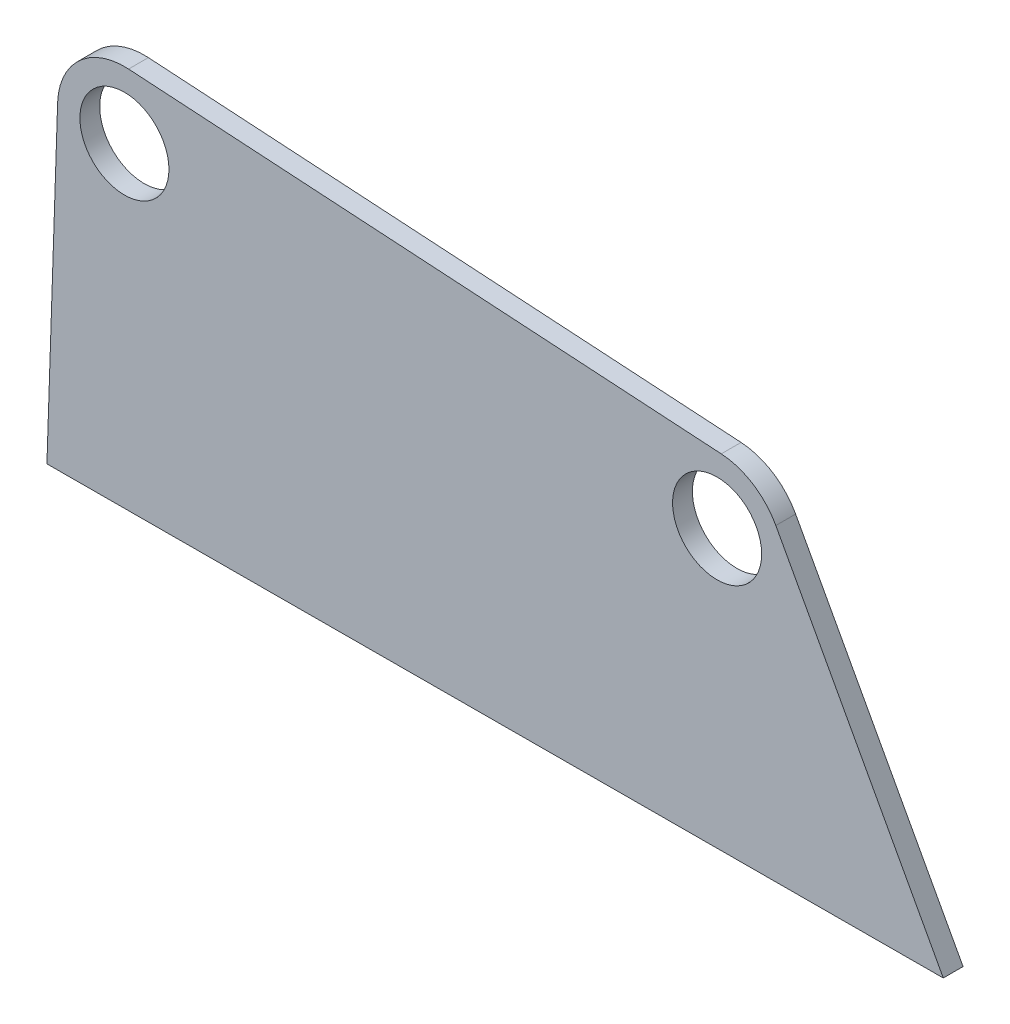
ISO-10303-21;
HEADER;
FILE_DESCRIPTION(('STEP AP214'),'2;1');
FILE_NAME('part.step','',(''),(''),'','','');
FILE_SCHEMA(('AUTOMOTIVE_DESIGN { 1 0 10303 214 1 1 1 1 }'));
ENDSEC;
DATA;
#1=APPLICATION_CONTEXT('core data for automotive mechanical design processes');
#2=APPLICATION_PROTOCOL_DEFINITION('international standard','automotive_design',2000,#1);
#3=PRODUCT_CONTEXT('',#1,'mechanical');
#4=PRODUCT('Part','Part','',(#3));
#5=PRODUCT_RELATED_PRODUCT_CATEGORY('part','',(#4));
#6=PRODUCT_DEFINITION_FORMATION('','',#4);
#7=PRODUCT_DEFINITION_CONTEXT('part definition',#1,'design');
#8=PRODUCT_DEFINITION('design','',#6,#7);
#9=PRODUCT_DEFINITION_SHAPE('','',#8);
#10=(LENGTH_UNIT() NAMED_UNIT(*) SI_UNIT(.MILLI.,.METRE.));
#11=(NAMED_UNIT(*) PLANE_ANGLE_UNIT() SI_UNIT($,.RADIAN.));
#12=(NAMED_UNIT(*) SI_UNIT($,.STERADIAN.) SOLID_ANGLE_UNIT());
#13=UNCERTAINTY_MEASURE_WITH_UNIT(LENGTH_MEASURE(1.E-05),#10,'distance_accuracy_value','');
#14=(GEOMETRIC_REPRESENTATION_CONTEXT(3) GLOBAL_UNCERTAINTY_ASSIGNED_CONTEXT((#13)) GLOBAL_UNIT_ASSIGNED_CONTEXT((#10,
#11,#12)) REPRESENTATION_CONTEXT('',''));
#15=CARTESIAN_POINT('',(0.,0.,0.));
#16=DIRECTION('',(0.,0.,1.));
#17=DIRECTION('',(1.,0.,0.));
#18=AXIS2_PLACEMENT_3D('',#15,#16,#17);
#19=CARTESIAN_POINT('',(13.925563591016,223.617790180787,3.175));
#20=DIRECTION('',(0.0621535517410026,0.998066598983243,0.));
#21=DIRECTION('',(-0.998066598983243,0.0621535517410026,0.));
#22=AXIS2_PLACEMENT_3D('',#19,#20,#21);
#23=PLANE('',#22);
#24=DIRECTION('',(0.998066598983243,-0.0621535517410026,0.));
#25=VECTOR('',#24,1.);
#26=CARTESIAN_POINT('',(13.925563591016,223.617790180787,-3.175));
#27=LINE('',#26,#25);
#28=CARTESIAN_POINT('',(143.15199643339,215.570349470762,-3.175));
#29=VERTEX_POINT('',#28);
#30=CARTESIAN_POINT('',(333.283683539698,203.730097864101,-3.175));
#31=VERTEX_POINT('',#30);
#32=EDGE_CURVE('E129',#29,#31,#27,.T.);
#33=ORIENTED_EDGE('',*,*,#32,.F.);
#34=DIRECTION('',(0.,0.,-1.));
#35=VECTOR('',#34,1.);
#36=CARTESIAN_POINT('',(143.15199643339,215.570349470762,3.175));
#37=LINE('',#36,#35);
#38=CARTESIAN_POINT('',(143.15199643339,215.570349470762,3.175));
#39=VERTEX_POINT('',#38);
#40=EDGE_CURVE('E11',#39,#29,#37,.T.);
#41=ORIENTED_EDGE('',*,*,#40,.F.);
#42=DIRECTION('',(0.998066598983243,-0.0621535517410026,0.));
#43=VECTOR('',#42,1.);
#44=CARTESIAN_POINT('',(13.925563591016,223.617790180787,3.175));
#45=LINE('',#44,#43);
#46=CARTESIAN_POINT('',(333.283683539698,203.730097864101,3.175));
#47=VERTEX_POINT('',#46);
#48=EDGE_CURVE('E146',#39,#47,#45,.T.);
#49=ORIENTED_EDGE('',*,*,#48,.T.);
#50=DIRECTION('',(0.,0.,-1.));
#51=VECTOR('',#50,1.);
#52=CARTESIAN_POINT('',(333.283683539698,203.730097864101,3.175));
#53=LINE('',#52,#51);
#54=EDGE_CURVE('E86',#47,#31,#53,.T.);
#55=ORIENTED_EDGE('',*,*,#54,.T.);
#56=EDGE_LOOP('',(#33,#41,#49,#55));
#57=FACE_BOUND('',#56,.T.);
#58=ADVANCED_FACE('F41',(#57),#23,.T.);
#59=CARTESIAN_POINT('',(141.81996812764,194.180534671303,3.175));
#60=DIRECTION('',(0.,0.,-1.));
#61=DIRECTION('',(-1.,0.,0.));
#62=AXIS2_PLACEMENT_3D('',#59,#60,#61);
#63=CYLINDRICAL_SURFACE('',#62,21.4312500000001);
#64=CARTESIAN_POINT('',(141.81996812764,194.180534671303,-3.175));
#65=DIRECTION('',(0.,0.,1.));
#66=DIRECTION('',(1.,0.,0.));
#67=AXIS2_PLACEMENT_3D('',#64,#65,#66);
#68=CIRCLE('',#67,21.4312500000001);
#69=CARTESIAN_POINT('',(120.400853613145,194.901651844464,-3.175));
#70=VERTEX_POINT('',#69);
#71=EDGE_CURVE('E132',#29,#70,#68,.T.);
#72=ORIENTED_EDGE('',*,*,#71,.T.);
#73=DIRECTION('',(0.,0.,-1.));
#74=VECTOR('',#73,1.);
#75=CARTESIAN_POINT('',(120.400853613145,194.901651844464,3.175));
#76=LINE('',#75,#74);
#77=CARTESIAN_POINT('',(120.400853613145,194.901651844464,3.175));
#78=VERTEX_POINT('',#77);
#79=EDGE_CURVE('E49',#78,#70,#76,.T.);
#80=ORIENTED_EDGE('',*,*,#79,.F.);
#81=CARTESIAN_POINT('',(141.81996812764,194.180534671303,3.175));
#82=DIRECTION('',(0.,0.,1.));
#83=DIRECTION('',(1.,0.,0.));
#84=AXIS2_PLACEMENT_3D('',#81,#82,#83);
#85=CIRCLE('',#84,21.4312500000001);
#86=EDGE_CURVE('E162',#39,#78,#85,.T.);
#87=ORIENTED_EDGE('',*,*,#86,.F.);
#88=ORIENTED_EDGE('',*,*,#40,.T.);
#89=EDGE_LOOP('',(#72,#80,#87,#88));
#90=FACE_BOUND('',#89,.T.);
#91=ADVANCED_FACE('F165',(#90),#63,.T.);
#92=CARTESIAN_POINT('',(113.710214405219,-3.82828096446189,3.175));
#93=DIRECTION('',(0.999433748124608,-0.0336479287564392,0.));
#94=DIRECTION('',(0.0336479287564392,0.999433748124608,0.));
#95=AXIS2_PLACEMENT_3D('',#92,#93,#94);
#96=PLANE('',#95);
#97=DIRECTION('',(-0.0336479287564392,-0.999433748124608,0.));
#98=VECTOR('',#97,1.);
#99=CARTESIAN_POINT('',(113.710214405219,-3.82828096446189,-3.175));
#100=LINE('',#99,#98);
#101=CARTESIAN_POINT('',(116.962765473806,92.7812110781298,-3.175));
#102=VERTEX_POINT('',#101);
#103=EDGE_CURVE('E134',#70,#102,#100,.T.);
#104=ORIENTED_EDGE('',*,*,#103,.T.);
#105=DIRECTION('',(0.,0.,-1.));
#106=VECTOR('',#105,1.);
#107=CARTESIAN_POINT('',(116.962765473806,92.7812110781298,3.175));
#108=LINE('',#107,#106);
#109=CARTESIAN_POINT('',(116.962765473806,92.7812110781298,3.175));
#110=VERTEX_POINT('',#109);
#111=EDGE_CURVE('E115',#110,#102,#108,.T.);
#112=ORIENTED_EDGE('',*,*,#111,.F.);
#113=DIRECTION('',(-0.0336479287564392,-0.999433748124608,0.));
#114=VECTOR('',#113,1.);
#115=CARTESIAN_POINT('',(113.710214405219,-3.82828096446189,3.175));
#116=LINE('',#115,#114);
#117=EDGE_CURVE('E106',#78,#110,#116,.T.);
#118=ORIENTED_EDGE('',*,*,#117,.F.);
#119=ORIENTED_EDGE('',*,*,#79,.T.);
#120=EDGE_LOOP('',(#104,#112,#118,#119));
#121=FACE_BOUND('',#120,.T.);
#122=ADVANCED_FACE('F153',(#121),#96,.F.);
#123=CARTESIAN_POINT('',(-0.30359503844637,92.3958965070931,3.175));
#124=DIRECTION('',(-0.00328578877472885,0.999994601781493,0.));
#125=DIRECTION('',(-0.999994601781494,-0.00328578877472885,0.));
#126=AXIS2_PLACEMENT_3D('',#123,#124,#125);
#127=PLANE('',#126);
#128=DIRECTION('',(0.999994601781494,0.00328578877472885,0.));
#129=VECTOR('',#128,1.);
#130=CARTESIAN_POINT('',(-0.30359503844637,92.3958965070931,-3.175));
#131=LINE('',#130,#129);
#132=CARTESIAN_POINT('',(404.499149114623,93.726,-3.175));
#133=VERTEX_POINT('',#132);
#134=EDGE_CURVE('E114',#102,#133,#131,.T.);
#135=ORIENTED_EDGE('',*,*,#134,.T.);
#136=DIRECTION('',(0.,0.,-1.));
#137=VECTOR('',#136,1.);
#138=CARTESIAN_POINT('',(404.499149114623,93.726,3.175));
#139=LINE('',#138,#137);
#140=CARTESIAN_POINT('',(404.499149114623,93.726,3.175));
#141=VERTEX_POINT('',#140);
#142=EDGE_CURVE('E111',#141,#133,#139,.T.);
#143=ORIENTED_EDGE('',*,*,#142,.F.);
#144=DIRECTION('',(0.999994601781494,0.00328578877472885,0.));
#145=VECTOR('',#144,1.);
#146=CARTESIAN_POINT('',(-0.30359503844637,92.3958965070931,3.175));
#147=LINE('',#146,#145);
#148=EDGE_CURVE('E99',#110,#141,#147,.T.);
#149=ORIENTED_EDGE('',*,*,#148,.F.);
#150=ORIENTED_EDGE('',*,*,#111,.T.);
#151=EDGE_LOOP('',(#135,#143,#149,#150));
#152=FACE_BOUND('',#151,.T.);
#153=ADVANCED_FACE('F112',(#152),#127,.F.);
#154=CARTESIAN_POINT('',(351.598472051144,191.070967862355,3.175));
#155=DIRECTION('',(-0.878640401948522,-0.477484077288175,0.));
#156=DIRECTION('',(0.477484077288175,-0.878640401948522,0.));
#157=AXIS2_PLACEMENT_3D('',#154,#155,#156);
#158=PLANE('',#157);
#159=DIRECTION('',(-0.477484077288175,0.878640401948522,0.));
#160=VECTOR('',#159,1.);
#161=CARTESIAN_POINT('',(351.598472051144,191.070967862355,-3.175));
#162=LINE('',#161,#160);
#163=CARTESIAN_POINT('',(350.782017348207,192.573363696024,-3.175));
#164=VERTEX_POINT('',#163);
#165=EDGE_CURVE('E79',#133,#164,#162,.T.);
#166=ORIENTED_EDGE('',*,*,#165,.T.);
#167=DIRECTION('',(0.,0.,-1.));
#168=VECTOR('',#167,1.);
#169=CARTESIAN_POINT('',(350.782017348207,192.573363696024,3.175));
#170=LINE('',#169,#168);
#171=CARTESIAN_POINT('',(350.782017348207,192.573363696024,3.175));
#172=VERTEX_POINT('',#171);
#173=EDGE_CURVE('E116',#172,#164,#170,.T.);
#174=ORIENTED_EDGE('',*,*,#173,.F.);
#175=DIRECTION('',(-0.477484077288175,0.878640401948522,0.));
#176=VECTOR('',#175,1.);
#177=CARTESIAN_POINT('',(351.598472051144,191.070967862355,3.175));
#178=LINE('',#177,#176);
#179=EDGE_CURVE('E104',#141,#172,#178,.T.);
#180=ORIENTED_EDGE('',*,*,#179,.F.);
#181=ORIENTED_EDGE('',*,*,#142,.T.);
#182=EDGE_LOOP('',(#166,#174,#180,#181));
#183=FACE_BOUND('',#182,.T.);
#184=ADVANCED_FACE('F118',(#183),#158,.F.);
#185=CARTESIAN_POINT('',(331.951655233948,182.340283064642,3.175));
#186=DIRECTION('',(0.,0.,-1.));
#187=DIRECTION('',(-1.,0.,0.));
#188=AXIS2_PLACEMENT_3D('',#185,#186,#187);
#189=CYLINDRICAL_SURFACE('',#188,14.2875);
#190=CARTESIAN_POINT('',(331.951655233948,182.340283064642,3.175));
#191=DIRECTION('',(0.,0.,1.));
#192=DIRECTION('',(1.,0.,0.));
#193=AXIS2_PLACEMENT_3D('',#190,#191,#192);
#194=CIRCLE('',#193,14.2875);
#195=CARTESIAN_POINT('',(346.239155233948,182.340283064642,3.175));
#196=VERTEX_POINT('',#195);
#197=EDGE_CURVE('E120',#196,#196,#194,.T.);
#198=ORIENTED_EDGE('',*,*,#197,.T.);
#199=EDGE_LOOP('',(#198));
#200=FACE_BOUND('',#199,.T.);
#201=CARTESIAN_POINT('',(331.951655233948,182.340283064642,-3.175));
#202=DIRECTION('',(0.,0.,1.));
#203=DIRECTION('',(1.,0.,0.));
#204=AXIS2_PLACEMENT_3D('',#201,#202,#203);
#205=CIRCLE('',#204,14.2875);
#206=CARTESIAN_POINT('',(346.239155233948,182.340283064642,-3.175));
#207=VERTEX_POINT('',#206);
#208=EDGE_CURVE('E140',#207,#207,#205,.T.);
#209=ORIENTED_EDGE('',*,*,#208,.F.);
#210=EDGE_LOOP('',(#209));
#211=FACE_BOUND('',#210,.T.);
#212=ADVANCED_FACE('F177',(#200,#211),#189,.F.);
#213=CARTESIAN_POINT('',(331.951655233948,182.340283064642,3.175));
#214=DIRECTION('',(0.,0.,-1.));
#215=DIRECTION('',(-1.,0.,0.));
#216=AXIS2_PLACEMENT_3D('',#213,#214,#215);
#217=CYLINDRICAL_SURFACE('',#216,21.43125);
#218=CARTESIAN_POINT('',(331.951655233948,182.340283064642,-3.175));
#219=DIRECTION('',(0.,0.,1.));
#220=DIRECTION('',(1.,0.,0.));
#221=AXIS2_PLACEMENT_3D('',#218,#219,#220);
#222=CIRCLE('',#221,21.43125);
#223=EDGE_CURVE('E138',#164,#31,#222,.T.);
#224=ORIENTED_EDGE('',*,*,#223,.T.);
#225=ORIENTED_EDGE('',*,*,#54,.F.);
#226=CARTESIAN_POINT('',(331.951655233948,182.340283064642,3.175));
#227=DIRECTION('',(0.,0.,1.));
#228=DIRECTION('',(1.,0.,0.));
#229=AXIS2_PLACEMENT_3D('',#226,#227,#228);
#230=CIRCLE('',#229,21.43125);
#231=EDGE_CURVE('E57',#172,#47,#230,.T.);
#232=ORIENTED_EDGE('',*,*,#231,.F.);
#233=ORIENTED_EDGE('',*,*,#173,.T.);
#234=EDGE_LOOP('',(#224,#225,#232,#233));
#235=FACE_BOUND('',#234,.T.);
#236=ADVANCED_FACE('F161',(#235),#217,.T.);
#237=CARTESIAN_POINT('',(141.81996812764,194.180534671303,3.175));
#238=DIRECTION('',(0.,0.,-1.));
#239=DIRECTION('',(-1.,0.,0.));
#240=AXIS2_PLACEMENT_3D('',#237,#238,#239);
#241=CYLINDRICAL_SURFACE('',#240,14.2874999999999);
#242=CARTESIAN_POINT('',(141.81996812764,194.180534671303,3.175));
#243=DIRECTION('',(0.,0.,1.));
#244=DIRECTION('',(1.,0.,0.));
#245=AXIS2_PLACEMENT_3D('',#242,#243,#244);
#246=CIRCLE('',#245,14.2874999999999);
#247=CARTESIAN_POINT('',(156.10746812764,194.180534671303,3.175));
#248=VERTEX_POINT('',#247);
#249=EDGE_CURVE('E126',#248,#248,#246,.T.);
#250=ORIENTED_EDGE('',*,*,#249,.T.);
#251=EDGE_LOOP('',(#250));
#252=FACE_BOUND('',#251,.T.);
#253=CARTESIAN_POINT('',(141.81996812764,194.180534671303,-3.175));
#254=DIRECTION('',(0.,0.,1.));
#255=DIRECTION('',(1.,0.,0.));
#256=AXIS2_PLACEMENT_3D('',#253,#254,#255);
#257=CIRCLE('',#256,14.2874999999999);
#258=CARTESIAN_POINT('',(156.10746812764,194.180534671303,-3.175));
#259=VERTEX_POINT('',#258);
#260=EDGE_CURVE('E143',#259,#259,#257,.T.);
#261=ORIENTED_EDGE('',*,*,#260,.F.);
#262=EDGE_LOOP('',(#261));
#263=FACE_BOUND('',#262,.T.);
#264=ADVANCED_FACE('F180',(#252,#263),#241,.F.);
#265=CARTESIAN_POINT('',(0.,0.,3.175));
#266=DIRECTION('',(0.,0.,1.));
#267=DIRECTION('',(1.,0.,0.));
#268=AXIS2_PLACEMENT_3D('',#265,#266,#267);
#269=PLANE('',#268);
#270=ORIENTED_EDGE('',*,*,#48,.F.);
#271=ORIENTED_EDGE('',*,*,#86,.T.);
#272=ORIENTED_EDGE('',*,*,#117,.T.);
#273=ORIENTED_EDGE('',*,*,#148,.T.);
#274=ORIENTED_EDGE('',*,*,#179,.T.);
#275=ORIENTED_EDGE('',*,*,#231,.T.);
#276=EDGE_LOOP('',(#270,#271,#272,#273,#274,#275));
#277=FACE_BOUND('',#276,.T.);
#278=ORIENTED_EDGE('',*,*,#197,.F.);
#279=EDGE_LOOP('',(#278));
#280=FACE_BOUND('',#279,.T.);
#281=ORIENTED_EDGE('',*,*,#249,.F.);
#282=EDGE_LOOP('',(#281));
#283=FACE_BOUND('',#282,.T.);
#284=ADVANCED_FACE('F101',(#277,#280,#283),#269,.T.);
#285=CARTESIAN_POINT('',(0.,0.,-3.175));
#286=DIRECTION('',(0.,0.,1.));
#287=DIRECTION('',(1.,0.,0.));
#288=AXIS2_PLACEMENT_3D('',#285,#286,#287);
#289=PLANE('',#288);
#290=ORIENTED_EDGE('',*,*,#32,.T.);
#291=ORIENTED_EDGE('',*,*,#223,.F.);
#292=ORIENTED_EDGE('',*,*,#165,.F.);
#293=ORIENTED_EDGE('',*,*,#134,.F.);
#294=ORIENTED_EDGE('',*,*,#103,.F.);
#295=ORIENTED_EDGE('',*,*,#71,.F.);
#296=EDGE_LOOP('',(#290,#291,#292,#293,#294,#295));
#297=FACE_BOUND('',#296,.T.);
#298=ORIENTED_EDGE('',*,*,#208,.T.);
#299=EDGE_LOOP('',(#298));
#300=FACE_BOUND('',#299,.T.);
#301=ORIENTED_EDGE('',*,*,#260,.T.);
#302=EDGE_LOOP('',(#301));
#303=FACE_BOUND('',#302,.T.);
#304=ADVANCED_FACE('F157',(#297,#300,#303),#289,.F.);
#305=CLOSED_SHELL('',(#58,#91,#122,#153,#184,#212,#236,#264,#284,#304));
#306=MANIFOLD_SOLID_BREP('B2',#305);
#307=ADVANCED_BREP_SHAPE_REPRESENTATION('',(#18,#306),#14);
#308=SHAPE_DEFINITION_REPRESENTATION(#9,#307);
ENDSEC;
END-ISO-10303-21;
